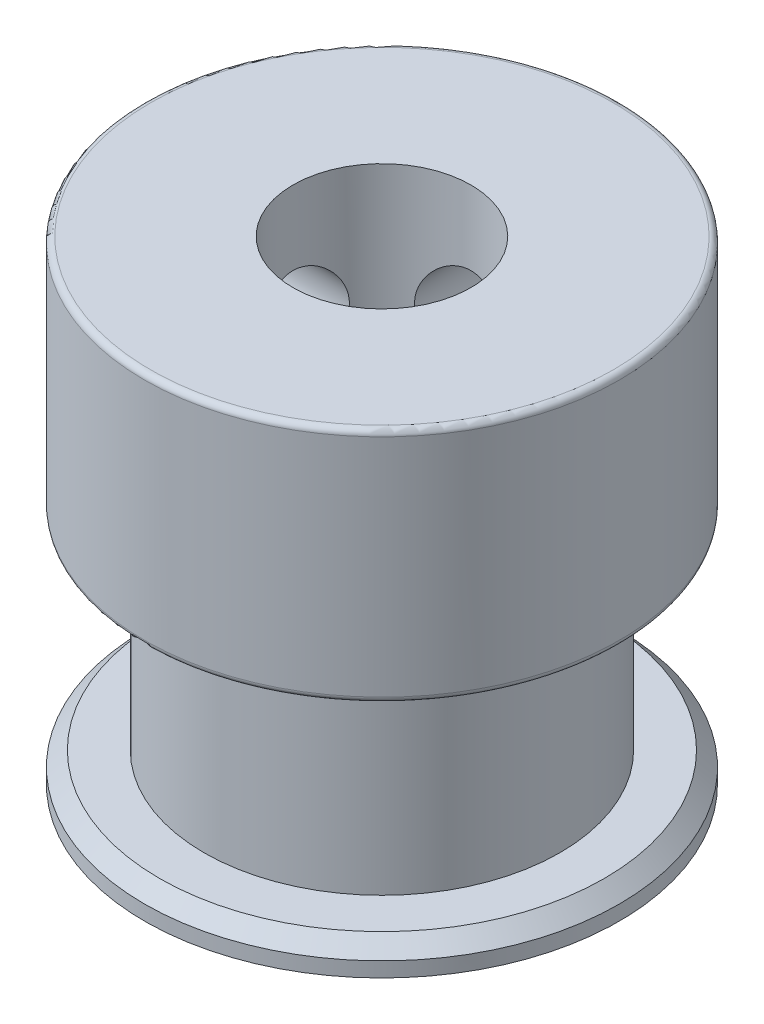
ISO-10303-21;
HEADER;
FILE_DESCRIPTION(('STEP AP214'),'2;1');
FILE_NAME('part.step','',(''),(''),'','','');
FILE_SCHEMA(('AUTOMOTIVE_DESIGN { 1 0 10303 214 1 1 1 1 }'));
ENDSEC;
DATA;
#1=APPLICATION_CONTEXT('core data for automotive mechanical design processes');
#2=APPLICATION_PROTOCOL_DEFINITION('international standard','automotive_design',2000,#1);
#3=PRODUCT_CONTEXT('',#1,'mechanical');
#4=PRODUCT('Part','Part','',(#3));
#5=PRODUCT_RELATED_PRODUCT_CATEGORY('part','',(#4));
#6=PRODUCT_DEFINITION_FORMATION('','',#4);
#7=PRODUCT_DEFINITION_CONTEXT('part definition',#1,'design');
#8=PRODUCT_DEFINITION('design','',#6,#7);
#9=PRODUCT_DEFINITION_SHAPE('','',#8);
#10=(LENGTH_UNIT() NAMED_UNIT(*) SI_UNIT(.MILLI.,.METRE.));
#11=(NAMED_UNIT(*) PLANE_ANGLE_UNIT() SI_UNIT($,.RADIAN.));
#12=(NAMED_UNIT(*) SI_UNIT($,.STERADIAN.) SOLID_ANGLE_UNIT());
#13=UNCERTAINTY_MEASURE_WITH_UNIT(LENGTH_MEASURE(1.E-05),#10,'distance_accuracy_value','');
#14=(GEOMETRIC_REPRESENTATION_CONTEXT(3) GLOBAL_UNCERTAINTY_ASSIGNED_CONTEXT((#13)) GLOBAL_UNIT_ASSIGNED_CONTEXT((#10,
#11,#12)) REPRESENTATION_CONTEXT('',''));
#15=CARTESIAN_POINT('',(0.,0.,0.));
#16=DIRECTION('',(0.,0.,1.));
#17=DIRECTION('',(1.,0.,0.));
#18=AXIS2_PLACEMENT_3D('',#15,#16,#17);
#19=CARTESIAN_POINT('',(0.,0.,0.));
#20=DIRECTION('',(0.,1.,0.));
#21=DIRECTION('',(-1.,0.,0.));
#22=AXIS2_PLACEMENT_3D('',#19,#20,#21);
#23=PLANE('',#22);
#24=CARTESIAN_POINT('',(0.,0.,0.));
#25=DIRECTION('',(0.,1.,0.));
#26=DIRECTION('',(-1.,0.,0.));
#27=AXIS2_PLACEMENT_3D('',#24,#25,#26);
#28=CIRCLE('',#27,3.);
#29=CARTESIAN_POINT('',(-3.,0.,0.));
#30=VERTEX_POINT('',#29);
#31=EDGE_CURVE('E146',#30,#30,#28,.T.);
#32=ORIENTED_EDGE('',*,*,#31,.T.);
#33=EDGE_LOOP('',(#32));
#34=FACE_BOUND('',#33,.T.);
#35=CARTESIAN_POINT('',(0.,0.,0.));
#36=DIRECTION('',(0.,1.,0.));
#37=DIRECTION('',(-1.,0.,0.));
#38=AXIS2_PLACEMENT_3D('',#35,#36,#37);
#39=CIRCLE('',#38,8.);
#40=CARTESIAN_POINT('',(-8.,0.,0.));
#41=VERTEX_POINT('',#40);
#42=EDGE_CURVE('E157',#41,#41,#39,.T.);
#43=ORIENTED_EDGE('',*,*,#42,.F.);
#44=EDGE_LOOP('',(#43));
#45=FACE_BOUND('',#44,.T.);
#46=ADVANCED_FACE('F45',(#34,#45),#23,.F.);
#47=CARTESIAN_POINT('',(0.,16.,0.));
#48=DIRECTION('',(0.,1.,0.));
#49=DIRECTION('',(-1.,0.,0.));
#50=AXIS2_PLACEMENT_3D('',#47,#48,#49);
#51=CYLINDRICAL_SURFACE('',#50,8.);
#52=CARTESIAN_POINT('',(0.,0.500000000000004,0.));
#53=DIRECTION('',(0.,-1.,0.));
#54=DIRECTION('',(1.,0.,0.));
#55=AXIS2_PLACEMENT_3D('',#52,#53,#54);
#56=CIRCLE('',#55,8.);
#57=CARTESIAN_POINT('',(8.,0.500000000000004,0.));
#58=VERTEX_POINT('',#57);
#59=EDGE_CURVE('E65',#58,#58,#56,.T.);
#60=ORIENTED_EDGE('',*,*,#59,.T.);
#61=EDGE_LOOP('',(#60));
#62=FACE_BOUND('',#61,.T.);
#63=ORIENTED_EDGE('',*,*,#42,.T.);
#64=EDGE_LOOP('',(#63));
#65=FACE_BOUND('',#64,.T.);
#66=ADVANCED_FACE('F120',(#62,#65),#51,.T.);
#67=CARTESIAN_POINT('',(8.,1.,0.));
#68=DIRECTION('',(0.,-1.,0.));
#69=DIRECTION('',(1.,0.,0.));
#70=AXIS2_PLACEMENT_3D('',#67,#68,#69);
#71=PLANE('',#70);
#72=CARTESIAN_POINT('',(0.,1.,0.));
#73=DIRECTION('',(0.,-1.,0.));
#74=DIRECTION('',(1.,0.,0.));
#75=AXIS2_PLACEMENT_3D('',#72,#73,#74);
#76=CIRCLE('',#75,7.5);
#77=CARTESIAN_POINT('',(7.5,1.,0.));
#78=VERTEX_POINT('',#77);
#79=EDGE_CURVE('E160',#78,#78,#76,.F.);
#80=ORIENTED_EDGE('',*,*,#79,.T.);
#81=EDGE_LOOP('',(#80));
#82=FACE_BOUND('',#81,.T.);
#83=CARTESIAN_POINT('',(0.,0.999999999999999,0.));
#84=DIRECTION('',(0.,1.,0.));
#85=DIRECTION('',(-1.,0.,0.));
#86=AXIS2_PLACEMENT_3D('',#83,#84,#85);
#87=CIRCLE('',#86,6.);
#88=CARTESIAN_POINT('',(-6.,0.999999999999999,0.));
#89=VERTEX_POINT('',#88);
#90=EDGE_CURVE('E154',#89,#89,#87,.T.);
#91=ORIENTED_EDGE('',*,*,#90,.F.);
#92=EDGE_LOOP('',(#91));
#93=FACE_BOUND('',#92,.T.);
#94=ADVANCED_FACE('F116',(#82,#93),#71,.F.);
#95=CARTESIAN_POINT('',(0.,16.,0.));
#96=DIRECTION('',(0.,1.,0.));
#97=DIRECTION('',(-1.,0.,0.));
#98=AXIS2_PLACEMENT_3D('',#95,#96,#97);
#99=CYLINDRICAL_SURFACE('',#98,6.);
#100=CARTESIAN_POINT('',(0.,8.,0.));
#101=DIRECTION('',(0.,1.,0.));
#102=DIRECTION('',(-1.,0.,0.));
#103=AXIS2_PLACEMENT_3D('',#100,#101,#102);
#104=CIRCLE('',#103,6.);
#105=CARTESIAN_POINT('',(-6.,8.,0.));
#106=VERTEX_POINT('',#105);
#107=EDGE_CURVE('E149',#106,#106,#104,.T.);
#108=ORIENTED_EDGE('',*,*,#107,.F.);
#109=EDGE_LOOP('',(#108));
#110=FACE_BOUND('',#109,.T.);
#111=ORIENTED_EDGE('',*,*,#90,.T.);
#112=EDGE_LOOP('',(#111));
#113=FACE_BOUND('',#112,.T.);
#114=ADVANCED_FACE('F113',(#110,#113),#99,.T.);
#115=CARTESIAN_POINT('',(6.,8.,0.));
#116=DIRECTION('',(0.,1.,0.));
#117=DIRECTION('',(-1.,0.,0.));
#118=AXIS2_PLACEMENT_3D('',#115,#116,#117);
#119=PLANE('',#118);
#120=CARTESIAN_POINT('',(0.,8.,0.));
#121=DIRECTION('',(0.,1.,0.));
#122=DIRECTION('',(-1.,0.,0.));
#123=AXIS2_PLACEMENT_3D('',#120,#121,#122);
#124=CIRCLE('',#123,7.8);
#125=CARTESIAN_POINT('',(-7.8,8.,0.));
#126=VERTEX_POINT('',#125);
#127=EDGE_CURVE('E12',#126,#126,#124,.F.);
#128=ORIENTED_EDGE('',*,*,#127,.T.);
#129=EDGE_LOOP('',(#128));
#130=FACE_BOUND('',#129,.T.);
#131=ORIENTED_EDGE('',*,*,#107,.T.);
#132=EDGE_LOOP('',(#131));
#133=FACE_BOUND('',#132,.T.);
#134=ADVANCED_FACE('F109',(#130,#133),#119,.F.);
#135=CARTESIAN_POINT('',(0.,16.,0.));
#136=DIRECTION('',(0.,1.,0.));
#137=DIRECTION('',(-1.,0.,0.));
#138=AXIS2_PLACEMENT_3D('',#135,#136,#137);
#139=CYLINDRICAL_SURFACE('',#138,8.);
#140=CARTESIAN_POINT('',(0.,15.8,0.));
#141=DIRECTION('',(0.,-1.,0.));
#142=DIRECTION('',(1.,0.,0.));
#143=AXIS2_PLACEMENT_3D('',#140,#141,#142);
#144=CIRCLE('',#143,8.);
#145=CARTESIAN_POINT('',(8.,15.8,0.));
#146=VERTEX_POINT('',#145);
#147=EDGE_CURVE('E52',#146,#146,#144,.T.);
#148=ORIENTED_EDGE('',*,*,#147,.T.);
#149=EDGE_LOOP('',(#148));
#150=FACE_BOUND('',#149,.T.);
#151=CARTESIAN_POINT('',(0.,8.2,0.));
#152=DIRECTION('',(0.,1.,0.));
#153=DIRECTION('',(-1.,0.,0.));
#154=AXIS2_PLACEMENT_3D('',#151,#152,#153);
#155=CIRCLE('',#154,8.);
#156=CARTESIAN_POINT('',(-8.,8.2,0.));
#157=VERTEX_POINT('',#156);
#158=EDGE_CURVE('E56',#157,#157,#155,.T.);
#159=ORIENTED_EDGE('',*,*,#158,.T.);
#160=EDGE_LOOP('',(#159));
#161=FACE_BOUND('',#160,.T.);
#162=CARTESIAN_POINT('',(0.,13.5,-8.));
#163=CARTESIAN_POINT('',(-0.0834717464654712,13.4999968104117,-7.99999848833852));
#164=CARTESIAN_POINT('',(-0.166984992730099,13.4930089233806,-7.99868009921714));
#165=CARTESIAN_POINT('',(-0.331658129841798,13.4652600048817,-7.9935478589052));
#166=CARTESIAN_POINT('',(-0.412815974152226,13.4444873493603,-7.98973190166897));
#167=CARTESIAN_POINT('',(-0.570372961851802,13.3898272987407,-7.98003138765458));
#168=CARTESIAN_POINT('',(-0.646776330685344,13.3559517475475,-7.97414869946483));
#169=CARTESIAN_POINT('',(-0.792807973094006,13.2760811230772,-7.96095710599783));
#170=CARTESIAN_POINT('',(-0.862436794477323,13.2300870308552,-7.9536483161829));
#171=CARTESIAN_POINT('',(-0.993783715930502,13.1267002319963,-7.93831336430504));
#172=CARTESIAN_POINT('',(-1.05540895503183,13.0691905553299,-7.93028034856351));
#173=CARTESIAN_POINT('',(-1.16819606135369,12.9446566909124,-7.9144531845865));
#174=CARTESIAN_POINT('',(-1.21935717689241,12.8776318202307,-7.90665905354528));
#175=CARTESIAN_POINT('',(-1.31014998665793,12.735313911636,-7.89212551245006));
#176=CARTESIAN_POINT('',(-1.34968721969605,12.6599596296828,-7.88539493886182));
#177=CARTESIAN_POINT('',(-1.41550524332283,12.5035310848232,-7.87384713211987));
#178=CARTESIAN_POINT('',(-1.44178717713098,12.4224573158888,-7.86902973396962));
#179=CARTESIAN_POINT('',(-1.480050535035,12.2578847690856,-7.8619226957455));
#180=CARTESIAN_POINT('',(-1.49219390192039,12.1744249027965,-7.85960445366405));
#181=CARTESIAN_POINT('',(-1.50233808095346,12.0066226151918,-7.85767197152761));
#182=CARTESIAN_POINT('',(-1.50034016135374,11.9222802736977,-7.8580574889876));
#183=CARTESIAN_POINT('',(-1.48238979602362,11.756280474734,-7.86146292701753));
#184=CARTESIAN_POINT('',(-1.46662149996045,11.6746022856998,-7.86444808147334));
#185=CARTESIAN_POINT('',(-1.42186799396207,11.5150715802174,-7.87266183284666));
#186=CARTESIAN_POINT('',(-1.39288222239499,11.4372192264907,-7.87789052509516));
#187=CARTESIAN_POINT('',(-1.322336471793,11.2870113209997,-7.89003855292589));
#188=CARTESIAN_POINT('',(-1.28070213532456,11.2146915294192,-7.89696783823366));
#189=CARTESIAN_POINT('',(-1.18609368930416,11.0779952714598,-7.91172971602918));
#190=CARTESIAN_POINT('',(-1.13311842889266,11.0136196122852,-7.91956240015522));
#191=CARTESIAN_POINT('',(-1.01633905685298,10.8935750443275,-7.93540001272164));
#192=CARTESIAN_POINT('',(-0.95237743686068,10.8380593475483,-7.94340571024031));
#193=CARTESIAN_POINT('',(-0.815968037098824,10.7385227593246,-7.95857386108318));
#194=CARTESIAN_POINT('',(-0.743520172255768,10.6945019831296,-7.96573630595245));
#195=CARTESIAN_POINT('',(-0.592034988874667,10.61918224613,-7.97842539677509));
#196=CARTESIAN_POINT('',(-0.512989564446492,10.5878992208821,-7.98394999136289));
#197=CARTESIAN_POINT('',(-0.350639115398695,10.5390979069078,-7.99272505402719));
#198=CARTESIAN_POINT('',(-0.267334544277785,10.5215781559546,-7.99597576367994));
#199=CARTESIAN_POINT('',(-0.100148652903383,10.5010139689817,-7.99980360641981));
#200=CARTESIAN_POINT('',(-0.0162940126341331,10.4977596084703,-8.00041950912279));
#201=CARTESIAN_POINT('',(0.150761248092186,10.5052554795476,-7.99901543598228));
#202=CARTESIAN_POINT('',(0.233961900480387,10.5160050230653,-7.99699558964431));
#203=CARTESIAN_POINT('',(0.396681573218218,10.5510290351834,-7.99057111500406));
#204=CARTESIAN_POINT('',(0.476224261046064,10.5751972825378,-7.98618522374031));
#205=CARTESIAN_POINT('',(0.630128631824634,10.6362577067788,-7.97551842212498));
#206=CARTESIAN_POINT('',(0.704489962595104,10.6731507475658,-7.96923738311334));
#207=CARTESIAN_POINT('',(0.846816671513215,10.7590781281595,-7.95538030357666));
#208=CARTESIAN_POINT('',(0.914703277015123,10.8082407385368,-7.94779086174563));
#209=CARTESIAN_POINT('',(1.04133832326455,10.9171381373624,-7.93219343489711));
#210=CARTESIAN_POINT('',(1.10008590976087,10.9768739130013,-7.92418541084687));
#211=CARTESIAN_POINT('',(1.20757295872048,11.1061723189114,-7.9085247569745));
#212=CARTESIAN_POINT('',(1.25616916218577,11.1758549081254,-7.90087825860257));
#213=CARTESIAN_POINT('',(1.34096675057787,11.3225176245238,-7.88692985578532));
#214=CARTESIAN_POINT('',(1.37716859613924,11.3994974803705,-7.8806279013735));
#215=CARTESIAN_POINT('',(1.43594673512823,11.5582058672425,-7.87013024209574));
#216=CARTESIAN_POINT('',(1.45858868794786,11.6399093795593,-7.86592440436878));
#217=CARTESIAN_POINT('',(1.48980679326236,11.8060472225214,-7.86007203802415));
#218=CARTESIAN_POINT('',(1.49838453270708,11.8904812439704,-7.8584252206579));
#219=CARTESIAN_POINT('',(1.50117762148355,12.0582483314415,-7.85789199803857));
#220=CARTESIAN_POINT('',(1.49561895003499,12.141577580957,-7.85896215974293));
#221=CARTESIAN_POINT('',(1.47079175378803,12.3060914220453,-7.86364600659998));
#222=CARTESIAN_POINT('',(1.45152331089332,12.3872760264274,-7.86725967655747));
#223=CARTESIAN_POINT('',(1.39991887583263,12.5450744847955,-7.8766050802318));
#224=CARTESIAN_POINT('',(1.36760735397252,12.6216965913458,-7.88233284594965));
#225=CARTESIAN_POINT('',(1.29085868912204,12.7684682542408,-7.8952638755184));
#226=CARTESIAN_POINT('',(1.24642068948186,12.8386173528448,-7.90246724360119));
#227=CARTESIAN_POINT('',(1.14589487339535,12.9715836800423,-7.91767266107745));
#228=CARTESIAN_POINT('',(1.08964259864303,13.0342754125671,-7.92568505353043));
#229=CARTESIAN_POINT('',(0.96742792674229,13.1494051624645,-7.94152833918735));
#230=CARTESIAN_POINT('',(0.901463301891615,13.2018408209801,-7.94935919027328));
#231=CARTESIAN_POINT('',(0.760984945071871,13.2954109526271,-7.96403975968049));
#232=CARTESIAN_POINT('',(0.686399590640515,13.3364394284906,-7.97088000990561));
#233=CARTESIAN_POINT('',(0.531290113653833,13.4053176366051,-7.98271619380687));
#234=CARTESIAN_POINT('',(0.450771651705247,13.4331797470469,-7.98771385879037));
#235=CARTESIAN_POINT('',(0.308347202825153,13.4692773144187,-7.99428290707632));
#236=CARTESIAN_POINT('',(0.24727381025187,13.4807786303128,-7.99641470878206));
#237=CARTESIAN_POINT('',(0.124141247115157,13.4961410621164,-7.9992737995401));
#238=CARTESIAN_POINT('',(0.0620821016527089,13.5000023722559,-8.00000112429805));
#239=CARTESIAN_POINT('',(0.,13.5,-8.));
#240=B_SPLINE_CURVE_WITH_KNOTS('',3,(#162,#163,#164,#165,#166,#167,#168,#169,#170,#171,#172,
#173,#174,#175,#176,#177,#178,#179,#180,#181,#182,#183,#184,#185,#186,#187,#188,#189,#190,#191,
#192,#193,#194,#195,#196,#197,#198,#199,#200,#201,#202,#203,#204,#205,#206,#207,#208,#209,#210,
#211,#212,#213,#214,#215,#216,#217,#218,#219,#220,#221,#222,#223,#224,#225,#226,#227,#228,#229,
#230,#231,#232,#233,#234,#235,#236,#237,#238,#239),.UNSPECIFIED.,.T.,.F.,(4,2,2,2,2,2,2,2,2,2,2,
2,2,2,2,2,2,2,2,2,2,2,2,2,2,2,2,2,2,2,2,2,2,2,2,2,2,2,4),(0.,0.250188200964924,
0.500587642535452,0.750761271230908,1.00091465336891,1.2537511801363,1.50660586283616,
1.76146190504358,2.01629596311949,2.26818151445336,2.52004447587256,2.76859000612766,
3.01714609846787,3.26719262629531,3.51726454049859,3.77127768464077,4.02529337544948,
4.27962588321699,4.53393136673745,4.78448174076097,5.03501980464583,5.28360233907828,
5.53220175338032,5.78351778017708,6.03485728413098,6.28953436987299,6.54420198954945,
6.79762627818559,7.05102196946512,7.30039252231748,7.54976158541506,7.79866496207692,
8.04758592655423,8.3002336996638,8.55293951262255,8.80792048916314,9.06266126931173,
9.24874344524409,9.4348208903954),.UNSPECIFIED.);
#241=CARTESIAN_POINT('',(0.,13.5,-8.));
#242=VERTEX_POINT('',#241);
#243=EDGE_CURVE('E74',#242,#242,#240,.T.);
#244=ORIENTED_EDGE('',*,*,#243,.T.);
#245=EDGE_LOOP('',(#244));
#246=FACE_BOUND('',#245,.T.);
#247=CARTESIAN_POINT('',(-8.,10.5,0.));
#248=CARTESIAN_POINT('',(-7.99999848833852,10.5000031895883,-0.0834717464654708));
#249=CARTESIAN_POINT('',(-7.99868009921714,10.5069910766194,-0.166984992730098));
#250=CARTESIAN_POINT('',(-7.9935478589052,10.5347399951183,-0.331658129841797));
#251=CARTESIAN_POINT('',(-7.98973190166897,10.5555126506397,-0.412815974152225));
#252=CARTESIAN_POINT('',(-7.98003138765458,10.6101727012593,-0.570372961851801));
#253=CARTESIAN_POINT('',(-7.97414869946483,10.6440482524525,-0.646776330685344));
#254=CARTESIAN_POINT('',(-7.96095710599783,10.7239188769228,-0.792807973094006));
#255=CARTESIAN_POINT('',(-7.9536483161829,10.7699129691448,-0.862436794477323));
#256=CARTESIAN_POINT('',(-7.93831336430504,10.8732997680037,-0.993783715930502));
#257=CARTESIAN_POINT('',(-7.93028034856351,10.9308094446701,-1.05540895503183));
#258=CARTESIAN_POINT('',(-7.9144531845865,11.0553433090876,-1.16819606135369));
#259=CARTESIAN_POINT('',(-7.90665905354527,11.1223681797693,-1.21935717689241));
#260=CARTESIAN_POINT('',(-7.89212551245005,11.264686088364,-1.31014998665793));
#261=CARTESIAN_POINT('',(-7.88539493886182,11.3400403703172,-1.34968721969605));
#262=CARTESIAN_POINT('',(-7.87384713211987,11.4964689151768,-1.41550524332283));
#263=CARTESIAN_POINT('',(-7.86902973396962,11.5775426841112,-1.44178717713098));
#264=CARTESIAN_POINT('',(-7.8619226957455,11.7421152309144,-1.480050535035));
#265=CARTESIAN_POINT('',(-7.85960445366405,11.8255750972035,-1.49219390192039));
#266=CARTESIAN_POINT('',(-7.85767197152761,11.9933773848082,-1.50233808095346));
#267=CARTESIAN_POINT('',(-7.8580574889876,12.0777197263023,-1.50034016135374));
#268=CARTESIAN_POINT('',(-7.86146292701753,12.243719525266,-1.48238979602362));
#269=CARTESIAN_POINT('',(-7.86444808147334,12.3253977143002,-1.46662149996045));
#270=CARTESIAN_POINT('',(-7.87266183284666,12.4849284197826,-1.42186799396207));
#271=CARTESIAN_POINT('',(-7.87789052509516,12.5627807735093,-1.39288222239499));
#272=CARTESIAN_POINT('',(-7.89003855292589,12.7129886790003,-1.322336471793));
#273=CARTESIAN_POINT('',(-7.89696783823366,12.7853084705808,-1.28070213532456));
#274=CARTESIAN_POINT('',(-7.91172971602918,12.9220047285402,-1.18609368930416));
#275=CARTESIAN_POINT('',(-7.91956240015522,12.9863803877148,-1.13311842889266));
#276=CARTESIAN_POINT('',(-7.93540001272164,13.1064249556725,-1.01633905685298));
#277=CARTESIAN_POINT('',(-7.94340571024031,13.1619406524517,-0.952377436860682));
#278=CARTESIAN_POINT('',(-7.95857386108318,13.2614772406754,-0.815968037098826));
#279=CARTESIAN_POINT('',(-7.96573630595245,13.3054980168704,-0.743520172255769));
#280=CARTESIAN_POINT('',(-7.97842539677509,13.38081775387,-0.592034988874668));
#281=CARTESIAN_POINT('',(-7.98394999136289,13.4121007791179,-0.512989564446494));
#282=CARTESIAN_POINT('',(-7.99272505402719,13.4609020930922,-0.350639115398697));
#283=CARTESIAN_POINT('',(-7.99597576367994,13.4784218440454,-0.267334544277787));
#284=CARTESIAN_POINT('',(-7.99980360641981,13.4989860310183,-0.100148652903385));
#285=CARTESIAN_POINT('',(-8.00041950912279,13.5022403915297,-0.0162940126341352));
#286=CARTESIAN_POINT('',(-7.99901543598228,13.4947445204524,0.150761248092184));
#287=CARTESIAN_POINT('',(-7.99699558964431,13.4839949769347,0.233961900480385));
#288=CARTESIAN_POINT('',(-7.99057111500406,13.4489709648166,0.396681573218217));
#289=CARTESIAN_POINT('',(-7.98618522374031,13.4248027174622,0.476224261046063));
#290=CARTESIAN_POINT('',(-7.97551842212498,13.3637422932212,0.630128631824633));
#291=CARTESIAN_POINT('',(-7.96923738311334,13.3268492524342,0.704489962595103));
#292=CARTESIAN_POINT('',(-7.95538030357666,13.2409218718405,0.846816671513213));
#293=CARTESIAN_POINT('',(-7.94779086174563,13.1917592614632,0.91470327701512));
#294=CARTESIAN_POINT('',(-7.93219343489712,13.0828618626376,1.04133832326454));
#295=CARTESIAN_POINT('',(-7.92418541084687,13.0231260869987,1.10008590976087));
#296=CARTESIAN_POINT('',(-7.9085247569745,12.8938276810886,1.20757295872048));
#297=CARTESIAN_POINT('',(-7.90087825860257,12.8241450918746,1.25616916218576));
#298=CARTESIAN_POINT('',(-7.88692985578532,12.6774823754762,1.34096675057787));
#299=CARTESIAN_POINT('',(-7.8806279013735,12.6005025196295,1.37716859613924));
#300=CARTESIAN_POINT('',(-7.87013024209574,12.4417941327575,1.43594673512823));
#301=CARTESIAN_POINT('',(-7.86592440436878,12.3600906204407,1.45858868794786));
#302=CARTESIAN_POINT('',(-7.86007203802415,12.1939527774786,1.48980679326235));
#303=CARTESIAN_POINT('',(-7.8584252206579,12.1095187560296,1.49838453270708));
#304=CARTESIAN_POINT('',(-7.85789199803857,11.9417516685585,1.50117762148355));
#305=CARTESIAN_POINT('',(-7.85896215974293,11.858422419043,1.49561895003499));
#306=CARTESIAN_POINT('',(-7.86364600659998,11.6939085779547,1.47079175378803));
#307=CARTESIAN_POINT('',(-7.86725967655747,11.6127239735726,1.45152331089332));
#308=CARTESIAN_POINT('',(-7.8766050802318,11.4549255152045,1.39991887583263));
#309=CARTESIAN_POINT('',(-7.88233284594965,11.3783034086542,1.36760735397252));
#310=CARTESIAN_POINT('',(-7.8952638755184,11.2315317457592,1.29085868912204));
#311=CARTESIAN_POINT('',(-7.90246724360119,11.1613826471552,1.24642068948186));
#312=CARTESIAN_POINT('',(-7.91767266107745,11.0284163199577,1.14589487339535));
#313=CARTESIAN_POINT('',(-7.92568505353043,10.9657245874329,1.08964259864303));
#314=CARTESIAN_POINT('',(-7.94152833918735,10.8505948375355,0.967427926742291));
#315=CARTESIAN_POINT('',(-7.94935919027328,10.7981591790199,0.901463301891616));
#316=CARTESIAN_POINT('',(-7.96403975968049,10.7045890473729,0.760984945071873));
#317=CARTESIAN_POINT('',(-7.97088000990561,10.6635605715094,0.686399590640517));
#318=CARTESIAN_POINT('',(-7.98271619380687,10.5946823633949,0.531290113653835));
#319=CARTESIAN_POINT('',(-7.98771385879037,10.5668202529531,0.450771651705249));
#320=CARTESIAN_POINT('',(-7.99428290707632,10.5307226855813,0.308347202825155));
#321=CARTESIAN_POINT('',(-7.99641470878206,10.5192213696872,0.247273810251872));
#322=CARTESIAN_POINT('',(-7.9992737995401,10.5038589378836,0.124141247115159));
#323=CARTESIAN_POINT('',(-8.00000112429805,10.4999976277441,0.0620821016527101));
#324=CARTESIAN_POINT('',(-8.,10.5,0.));
#325=B_SPLINE_CURVE_WITH_KNOTS('',3,(#247,#248,#249,#250,#251,#252,#253,#254,#255,#256,#257,
#258,#259,#260,#261,#262,#263,#264,#265,#266,#267,#268,#269,#270,#271,#272,#273,#274,#275,#276,
#277,#278,#279,#280,#281,#282,#283,#284,#285,#286,#287,#288,#289,#290,#291,#292,#293,#294,#295,
#296,#297,#298,#299,#300,#301,#302,#303,#304,#305,#306,#307,#308,#309,#310,#311,#312,#313,#314,
#315,#316,#317,#318,#319,#320,#321,#322,#323,#324),.UNSPECIFIED.,.T.,.F.,(4,2,2,2,2,2,2,2,2,2,2,
2,2,2,2,2,2,2,2,2,2,2,2,2,2,2,2,2,2,2,2,2,2,2,2,2,2,2,4),(0.,0.250188200964924,
0.500587642535452,0.750761271230907,1.00091465336891,1.2537511801363,1.50660586283617,
1.76146190504358,2.01629596311949,2.26818151445336,2.52004447587256,2.76859000612765,
3.01714609846787,3.26719262629531,3.51726454049859,3.77127768464077,4.02529337544948,
4.27962588321699,4.53393136673745,4.78448174076097,5.03501980464583,5.28360233907828,
5.53220175338032,5.78351778017708,6.03485728413098,6.28953436987299,6.54420198954945,
6.79762627818559,7.05102196946512,7.30039252231748,7.54976158541506,7.79866496207692,
8.04758592655423,8.3002336996638,8.55293951262255,8.80792048916314,9.06266126931173,
9.24874344524409,9.4348208903954),.UNSPECIFIED.);
#326=CARTESIAN_POINT('',(-8.,10.5,0.));
#327=VERTEX_POINT('',#326);
#328=EDGE_CURVE('E99',#327,#327,#325,.T.);
#329=ORIENTED_EDGE('',*,*,#328,.T.);
#330=EDGE_LOOP('',(#329));
#331=FACE_BOUND('',#330,.T.);
#332=ADVANCED_FACE('F104',(#150,#161,#246,#331),#139,.T.);
#333=CARTESIAN_POINT('',(8.,16.,0.));
#334=DIRECTION('',(0.,-1.,0.));
#335=DIRECTION('',(1.,0.,0.));
#336=AXIS2_PLACEMENT_3D('',#333,#334,#335);
#337=PLANE('',#336);
#338=CARTESIAN_POINT('',(0.,16.,0.));
#339=DIRECTION('',(0.,-1.,0.));
#340=DIRECTION('',(1.,0.,0.));
#341=AXIS2_PLACEMENT_3D('',#338,#339,#340);
#342=CIRCLE('',#341,7.8);
#343=CARTESIAN_POINT('',(7.8,16.,0.));
#344=VERTEX_POINT('',#343);
#345=EDGE_CURVE('E60',#344,#344,#342,.F.);
#346=ORIENTED_EDGE('',*,*,#345,.T.);
#347=EDGE_LOOP('',(#346));
#348=FACE_BOUND('',#347,.T.);
#349=CARTESIAN_POINT('',(0.,16.,0.));
#350=DIRECTION('',(0.,1.,0.));
#351=DIRECTION('',(-1.,0.,0.));
#352=AXIS2_PLACEMENT_3D('',#349,#350,#351);
#353=CIRCLE('',#352,3.);
#354=CARTESIAN_POINT('',(-3.,16.,0.));
#355=VERTEX_POINT('',#354);
#356=EDGE_CURVE('E144',#355,#355,#353,.T.);
#357=ORIENTED_EDGE('',*,*,#356,.F.);
#358=EDGE_LOOP('',(#357));
#359=FACE_BOUND('',#358,.T.);
#360=ADVANCED_FACE('F108',(#348,#359),#337,.F.);
#361=CARTESIAN_POINT('',(0.,1.,0.));
#362=DIRECTION('',(0.,-1.,0.));
#363=DIRECTION('',(1.,0.,0.));
#364=AXIS2_PLACEMENT_3D('',#361,#362,#363);
#365=CONICAL_SURFACE('',#364,7.5,0.785398163397448);
#366=ORIENTED_EDGE('',*,*,#59,.F.);
#367=EDGE_LOOP('',(#366));
#368=FACE_BOUND('',#367,.T.);
#369=ORIENTED_EDGE('',*,*,#79,.F.);
#370=EDGE_LOOP('',(#369));
#371=FACE_BOUND('',#370,.T.);
#372=ADVANCED_FACE('F128',(#368,#371),#365,.T.);
#373=CARTESIAN_POINT('',(0.,0.,0.));
#374=DIRECTION('',(0.,1.,0.));
#375=DIRECTION('',(-1.,0.,0.));
#376=AXIS2_PLACEMENT_3D('',#373,#374,#375);
#377=CYLINDRICAL_SURFACE('',#376,3.);
#378=CARTESIAN_POINT('',(1.5,12.,-2.59807621135332));
#379=CARTESIAN_POINT('',(1.4999945446118,11.9218382877071,-2.59808302092689));
#380=CARTESIAN_POINT('',(1.49384995609983,11.8435778827124,-2.60165701781635));
#381=CARTESIAN_POINT('',(1.46958481484708,11.6894591029843,-2.61543549678079));
#382=CARTESIAN_POINT('',(1.45143909683127,11.6136061274349,-2.62565391083339));
#383=CARTESIAN_POINT('',(1.40414992304972,11.4668225034841,-2.65124019908098));
#384=CARTESIAN_POINT('',(1.3750649287406,11.3958680212896,-2.66658065209878));
#385=CARTESIAN_POINT('',(1.30690128806456,11.2598636970049,-2.70063997225287));
#386=CARTESIAN_POINT('',(1.26782210105366,11.1948141746063,-2.71935902214097));
#387=CARTESIAN_POINT('',(1.17699981079632,11.0665414071637,-2.75995303586162));
#388=CARTESIAN_POINT('',(1.12447805421566,11.0039112964897,-2.7819609545693));
#389=CARTESIAN_POINT('',(1.0098807114217,10.8878874173899,-2.82557974178559));
#390=CARTESIAN_POINT('',(0.947800388673441,10.8344982561247,-2.84719040746875));
#391=CARTESIAN_POINT('',(0.810734345121821,10.7349492732785,-2.88932215429424));
#392=CARTESIAN_POINT('',(0.735160783518864,10.6895193482107,-2.90967159627259));
#393=CARTESIAN_POINT('',(0.576235539899258,10.6122887201314,-2.94526134149293));
#394=CARTESIAN_POINT('',(0.492888807207235,10.5804794157942,-2.96050486775612));
#395=CARTESIAN_POINT('',(0.327067415888967,10.5337430080484,-2.98320691866356));
#396=CARTESIAN_POINT('',(0.244952685733228,10.5177757104667,-2.99114220331338));
#397=CARTESIAN_POINT('',(0.0788559430467738,10.4997508219874,-3.00011375769101));
#398=CARTESIAN_POINT('',(-0.00512490876560633,10.4976848148064,-3.00115420176885));
#399=CARTESIAN_POINT('',(-0.164748786635624,10.5071200109555,-2.99644472874675));
#400=CARTESIAN_POINT('',(-0.240481798765186,10.5174570232818,-2.99127743838241));
#401=CARTESIAN_POINT('',(-0.388970657877482,10.549321265857,-2.97561367889621));
#402=CARTESIAN_POINT('',(-0.461726281640887,10.5708493334643,-2.96511681099591));
#403=CARTESIAN_POINT('',(-0.60346408735433,10.6246238491347,-2.93957374931482));
#404=CARTESIAN_POINT('',(-0.672380135272767,10.6570144697581,-2.92446662293799));
#405=CARTESIAN_POINT('',(-0.803965202269992,10.7313951243022,-2.89106468980031));
#406=CARTESIAN_POINT('',(-0.866631973257967,10.7733885949535,-2.87276874236226));
#407=CARTESIAN_POINT('',(-0.990260491347291,10.8703430272995,-2.83266591598844));
#408=CARTESIAN_POINT('',(-1.05050111254404,10.926154542489,-2.81069063997263));
#409=CARTESIAN_POINT('',(-1.16115655544667,11.0468845873953,-2.76681510880218));
#410=CARTESIAN_POINT('',(-1.21156381736134,11.1118100584111,-2.74491492398443));
#411=CARTESIAN_POINT('',(-1.30425800196332,11.2539722886361,-2.70216234138727));
#412=CARTESIAN_POINT('',(-1.34582597246708,11.3317290345813,-2.68146479986061));
#413=CARTESIAN_POINT('',(-1.41497866950185,11.4944065070385,-2.64563175417864));
#414=CARTESIAN_POINT('',(-1.44257798731633,11.5793196495263,-2.63049045069101));
#415=CARTESIAN_POINT('',(-1.48077031653756,11.7468217669242,-2.60916953725552));
#416=CARTESIAN_POINT('',(-1.49253768317996,11.8290616785653,-2.60237483772745));
#417=CARTESIAN_POINT('',(-1.50227541991714,11.9946020122748,-2.59676879042414));
#418=CARTESIAN_POINT('',(-1.50025553597254,12.0779016436797,-2.59795180333967));
#419=CARTESIAN_POINT('',(-1.48355406501595,12.2334808778681,-2.60751504810877));
#420=CARTESIAN_POINT('',(-1.4702817250687,12.3059691766619,-2.61509381259981));
#421=CARTESIAN_POINT('',(-1.43354442694866,12.4475516794064,-2.63541032327012));
#422=CARTESIAN_POINT('',(-1.41007616793542,12.5166447761199,-2.64814974007551));
#423=CARTESIAN_POINT('',(-1.35247138290733,12.653116996354,-2.67804333119485));
#424=CARTESIAN_POINT('',(-1.31789109553909,12.7202685252803,-2.69537464864595));
#425=CARTESIAN_POINT('',(-1.23943059602371,12.8482039073085,-2.73234179245875));
#426=CARTESIAN_POINT('',(-1.19554560649832,12.9089844652699,-2.75197880032721));
#427=CARTESIAN_POINT('',(-1.09325575079828,13.0304681512853,-2.79431997684504));
#428=CARTESIAN_POINT('',(-1.03371790847245,13.0901957260765,-2.81709874731434));
#429=CARTESIAN_POINT('',(-0.905106743097432,13.1991183569904,-2.86101352466839));
#430=CARTESIAN_POINT('',(-0.83603021198302,13.2483098553458,-2.88214897511564));
#431=CARTESIAN_POINT('',(-0.687803043838136,13.3358605889252,-2.92112042536435));
#432=CARTESIAN_POINT('',(-0.60843464636117,13.3738996773164,-2.93885462508044));
#433=CARTESIAN_POINT('',(-0.443283546961624,13.4357068557861,-2.96825032438951));
#434=CARTESIAN_POINT('',(-0.357506552088265,13.4594874770495,-2.97991715514559));
#435=CARTESIAN_POINT('',(-0.190469523495627,13.490052846262,-2.99501262272824));
#436=CARTESIAN_POINT('',(-0.109517165775687,13.4981968138142,-2.99909891862287));
#437=CARTESIAN_POINT('',(0.0526889789268047,13.5012648981816,-3.00063195562697));
#438=CARTESIAN_POINT('',(0.13394265044263,13.4961936427853,-2.99808102100335));
#439=CARTESIAN_POINT('',(0.28880698847572,13.4738753898066,-2.98700953256884));
#440=CARTESIAN_POINT('',(0.362568476716895,13.4574527261135,-2.97889342001985));
#441=CARTESIAN_POINT('',(0.506168928275426,13.4140095010455,-2.95788140495135));
#442=CARTESIAN_POINT('',(0.576007327433263,13.3869874198598,-2.94498481699194));
#443=CARTESIAN_POINT('',(0.713135109367327,13.321909421751,-2.9148889612218));
#444=CARTESIAN_POINT('',(0.780187714050069,13.2834310151882,-2.89752925798199));
#445=CARTESIAN_POINT('',(0.907161962721037,13.1970631037114,-2.86032199712739));
#446=CARTESIAN_POINT('',(0.96708031112236,13.1491692763265,-2.84047329837541));
#447=CARTESIAN_POINT('',(1.08437100623534,13.0398042914659,-2.79792915339941));
#448=CARTESIAN_POINT('',(1.14089652680891,12.9774562687842,-2.77514698517547));
#449=CARTESIAN_POINT('',(1.24299493109201,12.8438239183053,-2.73094614244278));
#450=CARTESIAN_POINT('',(1.28855812501509,12.7725317686985,-2.70952868642798));
#451=CARTESIAN_POINT('',(1.36864661967848,12.6200450301286,-2.66999407957374));
#452=CARTESIAN_POINT('',(1.40277759894141,12.5386087033069,-2.65200261384405));
#453=CARTESIAN_POINT('',(1.45631806425962,12.3700013934903,-2.62299234492527));
#454=CARTESIAN_POINT('',(1.47577678676302,12.282850666631,-2.61195024221553));
#455=CARTESIAN_POINT('',(1.49155051179662,12.162291966522,-2.60293908902686));
#456=CARTESIAN_POINT('',(1.49471415744578,12.1299481584032,-2.60112193507728));
#457=CARTESIAN_POINT('',(1.49894010763494,12.0650752789766,-2.59868903831625));
#458=CARTESIAN_POINT('',(1.50000227159981,12.0325461954212,-2.59807337587664));
#459=CARTESIAN_POINT('',(1.5,12.,-2.59807621135332));
#460=B_SPLINE_CURVE_WITH_KNOTS('',3,(#378,#379,#380,#381,#382,#383,#384,#385,#386,#387,#388,
#389,#390,#391,#392,#393,#394,#395,#396,#397,#398,#399,#400,#401,#402,#403,#404,#405,#406,#407,
#408,#409,#410,#411,#412,#413,#414,#415,#416,#417,#418,#419,#420,#421,#422,#423,#424,#425,#426,
#427,#428,#429,#430,#431,#432,#433,#434,#435,#436,#437,#438,#439,#440,#441,#442,#443,#444,#445,
#446,#447,#448,#449,#450,#451,#452,#453,#454,#455,#456,#457,#458,#459),.UNSPECIFIED.,.T.,.F.,(4,
2,2,2,2,2,2,2,2,2,2,2,2,2,2,2,2,2,2,2,2,2,2,2,2,2,2,2,2,2,2,2,2,2,2,2,2,2,2,2,4),(0.,
0.234348183892073,0.469189339237207,0.702792893878329,0.936409088167725,1.18929346874735,
1.44230356626556,1.71236838358145,1.98226240445836,2.23295227451903,2.4834903552906,
2.71224146226807,2.94100968776183,3.1729430209672,3.40495949025408,3.65890787185336,
3.91305072368878,4.18333262594172,4.45333161317557,4.70193436281317,4.95036139782559,
5.17161275136038,5.39293578654094,5.62450944609131,5.85620229330071,6.1171011537092,
6.37808797467303,6.64596272119449,6.91360169713157,7.1566840558423,7.39968130190957,
7.62666637307239,7.85368400268019,8.09041126079208,8.32724745151078,8.58765362775101,
8.84828914267731,9.11716123557907,9.3851269950414,9.48270202777964,9.58028358741811),.UNSPECIFIED.);
#461=CARTESIAN_POINT('',(1.5,12.,-2.59807621135332));
#462=VERTEX_POINT('',#461);
#463=EDGE_CURVE('E66',#462,#462,#460,.T.);
#464=ORIENTED_EDGE('',*,*,#463,.T.);
#465=EDGE_LOOP('',(#464));
#466=FACE_BOUND('',#465,.T.);
#467=CARTESIAN_POINT('',(-3.,10.5,0.));
#468=CARTESIAN_POINT('',(-2.99999570107562,10.5000049534758,0.0788579444268502));
#469=CARTESIAN_POINT('',(-2.99685736529635,10.5062551096816,0.157809899546344));
#470=CARTESIAN_POINT('',(-2.98461234055736,10.5309793205123,0.313380352903344));
#471=CARTESIAN_POINT('',(-2.97549431743379,10.5494765894967,0.389994130070444));
#472=CARTESIAN_POINT('',(-2.95224419105063,10.5977907129249,0.538400317320673));
#473=CARTESIAN_POINT('',(-2.93813158766306,10.627563576372,0.610210204408719));
#474=CARTESIAN_POINT('',(-2.90618664773642,10.6973559320475,0.747708925209898));
#475=CARTESIAN_POINT('',(-2.88835460450288,10.7373746163733,0.813398240985089));
#476=CARTESIAN_POINT('',(-2.84934387387093,10.8292758742279,0.941261726642864));
#477=CARTESIAN_POINT('',(-2.82802798691306,10.8817297188595,1.00298281668316));
#478=CARTESIAN_POINT('',(-2.78489955370115,10.9957822188706,1.11716916730047));
#479=CARTESIAN_POINT('',(-2.76308664313552,11.0573877776587,1.16962737466015));
#480=CARTESIAN_POINT('',(-2.71948426796021,11.1937250242851,1.26787800067542));
#481=CARTESIAN_POINT('',(-2.69782780455198,11.2691041475189,1.31283800332745));
#482=CARTESIAN_POINT('',(-2.65928968158481,11.4275510039793,1.38925234033604));
#483=CARTESIAN_POINT('',(-2.64240461410484,11.5106131930841,1.4207163224495));
#484=CARTESIAN_POINT('',(-2.61686800556713,11.6769976581329,1.46719866328288));
#485=CARTESIAN_POINT('',(-2.6077840737557,11.7600066781011,1.48308878562066));
#486=CARTESIAN_POINT('',(-2.59772834922792,11.9279682566692,1.50064048996327));
#487=CARTESIAN_POINT('',(-2.59674854014932,12.0129188113067,1.50231613255961));
#488=CARTESIAN_POINT('',(-2.60266395385873,12.1714290364731,1.49203093075844));
#489=CARTESIAN_POINT('',(-2.6086314549302,12.2451360468346,1.48167683930523));
#490=CARTESIAN_POINT('',(-2.62614343100775,12.3895828640596,1.4504097735854));
#491=CARTESIAN_POINT('',(-2.63768968247664,12.460321717958,1.42949343584648));
#492=CARTESIAN_POINT('',(-2.66531214619112,12.5988436988485,1.37731467057901));
#493=CARTESIAN_POINT('',(-2.68148760995998,12.6665195981787,1.34582260067399));
#494=CARTESIAN_POINT('',(-2.71655106422106,12.795951438885,1.273562531502));
#495=CARTESIAN_POINT('',(-2.73544027170286,12.8577047034001,1.2327903657187));
#496=CARTESIAN_POINT('',(-2.77669736854929,12.9817818791148,1.13709908236918));
#497=CARTESIAN_POINT('',(-2.79920265355119,13.0431853103642,1.08104168755392));
#498=CARTESIAN_POINT('',(-2.84321434950611,13.1561031278864,0.959333368112061));
#499=CARTESIAN_POINT('',(-2.86472027938201,13.2076127880508,0.893677884861429));
#500=CARTESIAN_POINT('',(-2.90552980924446,13.3015284915446,0.750774758747773));
#501=CARTESIAN_POINT('',(-2.92468476243011,13.3434007086686,0.673130387399114));
#502=CARTESIAN_POINT('',(-2.95736821681863,13.4131455435645,0.510699323233196));
#503=CARTESIAN_POINT('',(-2.9709011841533,13.4410292775228,0.425918364397915));
#504=CARTESIAN_POINT('',(-2.98986500612153,13.479713105575,0.259149737491054));
#505=CARTESIAN_POINT('',(-2.99587407451965,13.4917368536202,0.17751229582249));
#506=CARTESIAN_POINT('',(-3.00109520188655,13.5021970967017,0.0131693999240283));
#507=CARTESIAN_POINT('',(-3.00031048081978,13.5006400284592,-0.0695355298048623));
#508=CARTESIAN_POINT('',(-2.99236788380152,13.4846899673719,-0.22684945797898));
#509=CARTESIAN_POINT('',(-2.98570868532253,13.471301200905,-0.301589112074894));
#510=CARTESIAN_POINT('',(-2.9673325697226,13.4336428921573,-0.447610338452911));
#511=CARTESIAN_POINT('',(-2.95561509501618,13.4093721503198,-0.51889152853663));
#512=CARTESIAN_POINT('',(-2.92776377120382,13.3500023003505,-0.658332912674359));
#513=CARTESIAN_POINT('',(-2.91151322654446,13.3146134248256,-0.726345595508705));
#514=CARTESIAN_POINT('',(-2.87615961476127,13.2343386965302,-0.855692042548907));
#515=CARTESIAN_POINT('',(-2.85705533350408,13.1894487981069,-0.917022944664887));
#516=CARTESIAN_POINT('',(-2.81562332004297,13.0863593620039,-1.03765153393382));
#517=CARTESIAN_POINT('',(-2.79316327265249,13.0272856973323,-1.09615811672854));
#518=CARTESIAN_POINT('',(-2.7489358741323,12.9001122730834,-1.20278448167828));
#519=CARTESIAN_POINT('',(-2.72716901100071,12.8320063217281,-1.25089707856781));
#520=CARTESIAN_POINT('',(-2.68576788309734,12.6845345187405,-1.33756187171853));
#521=CARTESIAN_POINT('',(-2.66628794383591,12.6047831008583,-1.37553824370037));
#522=CARTESIAN_POINT('',(-2.63361108441202,12.4387348986376,-1.43712423890206));
#523=CARTESIAN_POINT('',(-2.62040607332625,12.3524467102997,-1.46075237380052));
#524=CARTESIAN_POINT('',(-2.60342251538703,12.1846346656729,-1.49079253120031));
#525=CARTESIAN_POINT('',(-2.59886075197597,12.1034486198471,-1.49863949460818));
#526=CARTESIAN_POINT('',(-2.59748031962405,11.9408293992532,-1.5010337315643));
#527=CARTESIAN_POINT('',(-2.60065829439585,11.8593963468932,-1.49558676993486));
#528=CARTESIAN_POINT('',(-2.61356793076615,11.7067747476998,-1.47288918838996));
#529=CARTESIAN_POINT('',(-2.62264641723988,11.6353492947829,-1.45681247151455));
#530=CARTESIAN_POINT('',(-2.64556524281479,11.4962878208635,-1.41476303733662));
#531=CARTESIAN_POINT('',(-2.65940711354503,11.428653026862,-1.38878713673988));
#532=CARTESIAN_POINT('',(-2.69142795546804,11.2940627235202,-1.32572361795085));
#533=CARTESIAN_POINT('',(-2.70983583593881,11.2274581472565,-1.28800670672355));
#534=CARTESIAN_POINT('',(-2.74852997452291,11.1010881957281,-1.20322645745609));
#535=CARTESIAN_POINT('',(-2.76881720693416,11.0413264042183,-1.15615825686234));
#536=CARTESIAN_POINT('',(-2.81193484737138,10.922787026468,-1.04730498999206));
#537=CARTESIAN_POINT('',(-2.83477474959942,10.8650113464746,-0.984426634495893));
#538=CARTESIAN_POINT('',(-2.87816628389896,10.7606055248471,-0.849232209349797));
#539=CARTESIAN_POINT('',(-2.89871667939293,10.7139813907951,-0.776911084957797));
#540=CARTESIAN_POINT('',(-2.93547014349806,10.6331454559319,-0.623897395174419));
#541=CARTESIAN_POINT('',(-2.95164144740899,10.5990237461453,-0.543149255665097));
#542=CARTESIAN_POINT('',(-2.9775201194848,10.5452877483639,-0.376113151707131));
#543=CARTESIAN_POINT('',(-2.98724585044602,10.5256322297914,-0.289841699383651));
#544=CARTESIAN_POINT('',(-2.99543192870217,10.5091538833714,-0.168902919736343));
#545=CARTESIAN_POINT('',(-2.99714048010376,10.5057260387005,-0.135242819162347));
#546=CARTESIAN_POINT('',(-2.99942545465223,10.5011480017289,-0.0677275977076369));
#547=CARTESIAN_POINT('',(-3.00000184655071,10.4999978722947,-0.0338724714699424));
#548=CARTESIAN_POINT('',(-3.,10.5,0.));
#549=B_SPLINE_CURVE_WITH_KNOTS('',3,(#467,#468,#469,#470,#471,#472,#473,#474,#475,#476,#477,
#478,#479,#480,#481,#482,#483,#484,#485,#486,#487,#488,#489,#490,#491,#492,#493,#494,#495,#496,
#497,#498,#499,#500,#501,#502,#503,#504,#505,#506,#507,#508,#509,#510,#511,#512,#513,#514,#515,
#516,#517,#518,#519,#520,#521,#522,#523,#524,#525,#526,#527,#528,#529,#530,#531,#532,#533,#534,
#535,#536,#537,#538,#539,#540,#541,#542,#543,#544,#545,#546,#547,#548),.UNSPECIFIED.,.T.,.F.,(4,
2,2,2,2,2,2,2,2,2,2,2,2,2,2,2,2,2,2,2,2,2,2,2,2,2,2,2,2,2,2,2,2,2,2,2,2,2,2,2,4),(0.,
0.236436386130439,0.473322224563796,0.709293233238448,0.945245640872351,1.19547263807713,
1.44588935648105,1.71572589646129,1.98536921847421,2.23887018210344,2.49212035993531,
2.7150856861398,2.93812205888517,3.16635360252731,3.39468781890333,3.65197412000818,
3.90938301898029,4.17874533321661,4.44789325368419,4.69474935707018,4.94148846767214,
5.16910359759183,5.39674382446397,5.63089284041848,5.86514176122509,6.12239415966628,
6.37982382923148,6.64972023242589,6.91926767918176,7.1629396125457,7.40650589797017,
7.62686895373283,7.84730293182526,8.08254685170431,8.31791341715446,8.58187864135757,
8.84598575071868,9.1119602049529,9.37717362931724,9.47872920200875,9.58028757766599),.UNSPECIFIED.);
#550=CARTESIAN_POINT('',(-3.,10.5,0.));
#551=VERTEX_POINT('',#550);
#552=EDGE_CURVE('E75',#551,#551,#549,.T.);
#553=ORIENTED_EDGE('',*,*,#552,.T.);
#554=EDGE_LOOP('',(#553));
#555=FACE_BOUND('',#554,.T.);
#556=ORIENTED_EDGE('',*,*,#31,.F.);
#557=EDGE_LOOP('',(#556));
#558=FACE_BOUND('',#557,.T.);
#559=ORIENTED_EDGE('',*,*,#356,.T.);
#560=EDGE_LOOP('',(#559));
#561=FACE_BOUND('',#560,.T.);
#562=ADVANCED_FACE('F81',(#466,#555,#558,#561),#377,.F.);
#563=CARTESIAN_POINT('',(-8.,12.,0.));
#564=DIRECTION('',(1.,0.,0.));
#565=DIRECTION('',(0.,0.,-1.));
#566=AXIS2_PLACEMENT_3D('',#563,#564,#565);
#567=CYLINDRICAL_SURFACE('',#566,1.5);
#568=ORIENTED_EDGE('',*,*,#552,.F.);
#569=EDGE_LOOP('',(#568));
#570=FACE_BOUND('',#569,.T.);
#571=ORIENTED_EDGE('',*,*,#328,.F.);
#572=EDGE_LOOP('',(#571));
#573=FACE_BOUND('',#572,.T.);
#574=ADVANCED_FACE('F88',(#570,#573),#567,.F.);
#575=CARTESIAN_POINT('',(0.,12.,-8.));
#576=DIRECTION('',(0.,0.,1.));
#577=DIRECTION('',(1.,0.,0.));
#578=AXIS2_PLACEMENT_3D('',#575,#576,#577);
#579=CYLINDRICAL_SURFACE('',#578,1.5);
#580=ORIENTED_EDGE('',*,*,#463,.F.);
#581=EDGE_LOOP('',(#580));
#582=FACE_BOUND('',#581,.T.);
#583=ORIENTED_EDGE('',*,*,#243,.F.);
#584=EDGE_LOOP('',(#583));
#585=FACE_BOUND('',#584,.T.);
#586=ADVANCED_FACE('F84',(#582,#585),#579,.F.);
#587=CARTESIAN_POINT('',(0.,15.8,0.));
#588=DIRECTION('',(0.,-1.,0.));
#589=DIRECTION('',(1.,0.,0.));
#590=AXIS2_PLACEMENT_3D('',#587,#588,#589);
#591=TOROIDAL_SURFACE('',#590,7.8,0.2);
#592=ORIENTED_EDGE('',*,*,#147,.F.);
#593=EDGE_LOOP('',(#592));
#594=FACE_BOUND('',#593,.T.);
#595=ORIENTED_EDGE('',*,*,#345,.F.);
#596=EDGE_LOOP('',(#595));
#597=FACE_BOUND('',#596,.T.);
#598=ADVANCED_FACE('F87',(#594,#597),#591,.T.);
#599=CARTESIAN_POINT('',(0.,8.2,0.));
#600=DIRECTION('',(0.,1.,0.));
#601=DIRECTION('',(-1.,0.,0.));
#602=AXIS2_PLACEMENT_3D('',#599,#600,#601);
#603=TOROIDAL_SURFACE('',#602,7.8,0.2);
#604=ORIENTED_EDGE('',*,*,#127,.F.);
#605=EDGE_LOOP('',(#604));
#606=FACE_BOUND('',#605,.T.);
#607=ORIENTED_EDGE('',*,*,#158,.F.);
#608=EDGE_LOOP('',(#607));
#609=FACE_BOUND('',#608,.T.);
#610=ADVANCED_FACE('F47',(#606,#609),#603,.T.);
#611=CLOSED_SHELL('',(#46,#66,#94,#114,#134,#332,#360,#372,#562,#574,#586,#598,#610));
#612=MANIFOLD_SOLID_BREP('B2',#611);
#613=ADVANCED_BREP_SHAPE_REPRESENTATION('',(#18,#612),#14);
#614=SHAPE_DEFINITION_REPRESENTATION(#9,#613);
ENDSEC;
END-ISO-10303-21;
